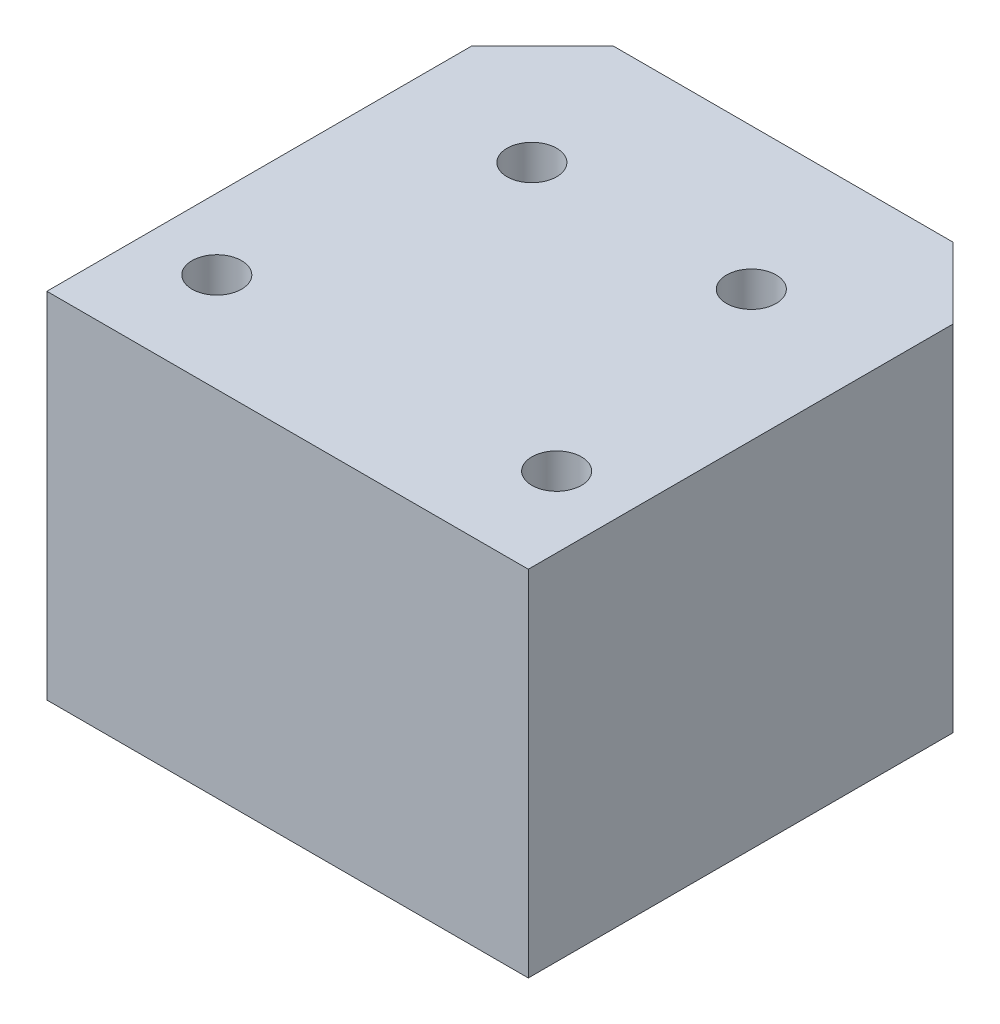
ISO-10303-21;
HEADER;
FILE_DESCRIPTION(('STEP AP214'),'2;1');
FILE_NAME('part.step','',(''),(''),'','','');
FILE_SCHEMA(('AUTOMOTIVE_DESIGN { 1 0 10303 214 1 1 1 1 }'));
ENDSEC;
DATA;
#1=APPLICATION_CONTEXT('core data for automotive mechanical design processes');
#2=APPLICATION_PROTOCOL_DEFINITION('international standard','automotive_design',2000,#1);
#3=PRODUCT_CONTEXT('',#1,'mechanical');
#4=PRODUCT('Part','Part','',(#3));
#5=PRODUCT_RELATED_PRODUCT_CATEGORY('part','',(#4));
#6=PRODUCT_DEFINITION_FORMATION('','',#4);
#7=PRODUCT_DEFINITION_CONTEXT('part definition',#1,'design');
#8=PRODUCT_DEFINITION('design','',#6,#7);
#9=PRODUCT_DEFINITION_SHAPE('','',#8);
#10=(LENGTH_UNIT() NAMED_UNIT(*) SI_UNIT(.MILLI.,.METRE.));
#11=(NAMED_UNIT(*) PLANE_ANGLE_UNIT() SI_UNIT($,.RADIAN.));
#12=(NAMED_UNIT(*) SI_UNIT($,.STERADIAN.) SOLID_ANGLE_UNIT());
#13=UNCERTAINTY_MEASURE_WITH_UNIT(LENGTH_MEASURE(1.E-05),#10,'distance_accuracy_value','');
#14=(GEOMETRIC_REPRESENTATION_CONTEXT(3) GLOBAL_UNCERTAINTY_ASSIGNED_CONTEXT((#13)) GLOBAL_UNIT_ASSIGNED_CONTEXT((#10,
#11,#12)) REPRESENTATION_CONTEXT('',''));
#15=CARTESIAN_POINT('',(0.,0.,0.));
#16=DIRECTION('',(0.,0.,1.));
#17=DIRECTION('',(1.,0.,0.));
#18=AXIS2_PLACEMENT_3D('',#15,#16,#17);
#19=CARTESIAN_POINT('',(-25.6426243932516,41.5511884848521,-30.));
#20=DIRECTION('',(-1.,0.,0.));
#21=DIRECTION('',(0.,-1.,0.));
#22=AXIS2_PLACEMENT_3D('',#19,#20,#21);
#23=PLANE('',#22);
#24=DIRECTION('',(0.,0.,1.));
#25=VECTOR('',#24,1.);
#26=CARTESIAN_POINT('',(-25.6426243932516,66.5511884848521,-30.));
#27=LINE('',#26,#25);
#28=CARTESIAN_POINT('',(-25.6426243932516,66.5511884848521,-25.));
#29=VERTEX_POINT('',#28);
#30=CARTESIAN_POINT('',(-25.6426243932516,66.5511884848521,5.));
#31=VERTEX_POINT('',#30);
#32=EDGE_CURVE('E90',#29,#31,#27,.T.);
#33=ORIENTED_EDGE('',*,*,#32,.F.);
#34=DIRECTION('',(0.,-1.,0.));
#35=VECTOR('',#34,1.);
#36=CARTESIAN_POINT('',(-25.6426243932516,41.5511884848521,-25.));
#37=LINE('',#36,#35);
#38=CARTESIAN_POINT('',(-25.6426243932516,41.5511884848521,-25.));
#39=VERTEX_POINT('',#38);
#40=EDGE_CURVE('E100',#29,#39,#37,.T.);
#41=ORIENTED_EDGE('',*,*,#40,.T.);
#42=DIRECTION('',(0.,0.,1.));
#43=VECTOR('',#42,1.);
#44=CARTESIAN_POINT('',(-25.6426243932516,41.5511884848521,-30.));
#45=LINE('',#44,#43);
#46=CARTESIAN_POINT('',(-25.6426243932516,41.5511884848521,5.));
#47=VERTEX_POINT('',#46);
#48=EDGE_CURVE('E106',#39,#47,#45,.T.);
#49=ORIENTED_EDGE('',*,*,#48,.T.);
#50=DIRECTION('',(0.,-1.,0.));
#51=VECTOR('',#50,1.);
#52=CARTESIAN_POINT('',(-25.6426243932516,66.5511884848521,5.));
#53=LINE('',#52,#51);
#54=EDGE_CURVE('E104',#31,#47,#53,.T.);
#55=ORIENTED_EDGE('',*,*,#54,.F.);
#56=EDGE_LOOP('',(#33,#41,#49,#55));
#57=FACE_BOUND('',#56,.T.);
#58=ADVANCED_FACE('F35',(#57),#23,.T.);
#59=CARTESIAN_POINT('',(8.35737560674839,66.5511884848521,-30.));
#60=DIRECTION('',(0.,1.,0.));
#61=DIRECTION('',(0.,0.,1.));
#62=AXIS2_PLACEMENT_3D('',#59,#60,#61);
#63=PLANE('',#62);
#64=CARTESIAN_POINT('',(-20.6426243932516,66.5511884848521,-2.));
#65=DIRECTION('',(0.,-1.,0.));
#66=DIRECTION('',(1.,0.,0.));
#67=AXIS2_PLACEMENT_3D('',#64,#65,#66);
#68=CIRCLE('',#67,1.75);
#69=CARTESIAN_POINT('',(-18.8926243932516,66.5511884848521,-2.));
#70=VERTEX_POINT('',#69);
#71=EDGE_CURVE('E210',#70,#70,#68,.T.);
#72=ORIENTED_EDGE('',*,*,#71,.T.);
#73=EDGE_LOOP('',(#72));
#74=FACE_BOUND('',#73,.T.);
#75=CARTESIAN_POINT('',(3.35737560674838,66.5511884848521,-2.));
#76=DIRECTION('',(0.,-1.,0.));
#77=DIRECTION('',(-1.,0.,0.));
#78=AXIS2_PLACEMENT_3D('',#75,#76,#77);
#79=CIRCLE('',#78,1.75);
#80=CARTESIAN_POINT('',(1.60737560674838,66.5511884848521,-2.));
#81=VERTEX_POINT('',#80);
#82=EDGE_CURVE('E201',#81,#81,#79,.T.);
#83=ORIENTED_EDGE('',*,*,#82,.T.);
#84=EDGE_LOOP('',(#83));
#85=FACE_BOUND('',#84,.T.);
#86=CARTESIAN_POINT('',(-0.892624393251621,66.5511884848521,-20.));
#87=DIRECTION('',(0.,-1.,0.));
#88=DIRECTION('',(1.,0.,0.));
#89=AXIS2_PLACEMENT_3D('',#86,#87,#88);
#90=CIRCLE('',#89,1.75);
#91=CARTESIAN_POINT('',(0.85737560674838,66.5511884848521,-20.));
#92=VERTEX_POINT('',#91);
#93=EDGE_CURVE('E196',#92,#92,#90,.T.);
#94=ORIENTED_EDGE('',*,*,#93,.T.);
#95=EDGE_LOOP('',(#94));
#96=FACE_BOUND('',#95,.T.);
#97=CARTESIAN_POINT('',(-16.3926243932516,66.5511884848521,-20.));
#98=DIRECTION('',(0.,-1.,0.));
#99=DIRECTION('',(1.,0.,0.));
#100=AXIS2_PLACEMENT_3D('',#97,#98,#99);
#101=CIRCLE('',#100,1.75);
#102=CARTESIAN_POINT('',(-14.6426243932516,66.5511884848521,-20.));
#103=VERTEX_POINT('',#102);
#104=EDGE_CURVE('E116',#103,#103,#101,.T.);
#105=ORIENTED_EDGE('',*,*,#104,.T.);
#106=EDGE_LOOP('',(#105));
#107=FACE_BOUND('',#106,.T.);
#108=DIRECTION('',(-1.,0.,0.));
#109=VECTOR('',#108,1.);
#110=CARTESIAN_POINT('',(8.35737560674839,66.5511884848521,-30.));
#111=LINE('',#110,#109);
#112=CARTESIAN_POINT('',(3.35737560674837,66.5511884848521,-30.));
#113=VERTEX_POINT('',#112);
#114=CARTESIAN_POINT('',(-20.6426243932516,66.5511884848521,-30.));
#115=VERTEX_POINT('',#114);
#116=EDGE_CURVE('E128',#113,#115,#111,.T.);
#117=ORIENTED_EDGE('',*,*,#116,.T.);
#118=DIRECTION('',(-0.707106781186549,0.,0.707106781186546));
#119=VECTOR('',#118,1.);
#120=CARTESIAN_POINT('',(-6.14262439325155,66.5511884848521,-44.5));
#121=LINE('',#120,#119);
#122=EDGE_CURVE('E43',#115,#29,#121,.T.);
#123=ORIENTED_EDGE('',*,*,#122,.T.);
#124=ORIENTED_EDGE('',*,*,#32,.T.);
#125=DIRECTION('',(-1.,0.,0.));
#126=VECTOR('',#125,1.);
#127=CARTESIAN_POINT('',(8.35737560674839,66.5511884848521,5.));
#128=LINE('',#127,#126);
#129=CARTESIAN_POINT('',(8.35737560674839,66.5511884848521,5.));
#130=VERTEX_POINT('',#129);
#131=EDGE_CURVE('E95',#130,#31,#128,.T.);
#132=ORIENTED_EDGE('',*,*,#131,.F.);
#133=DIRECTION('',(0.,0.,1.));
#134=VECTOR('',#133,1.);
#135=CARTESIAN_POINT('',(8.35737560674839,66.5511884848521,-30.));
#136=LINE('',#135,#134);
#137=CARTESIAN_POINT('',(8.35737560674839,66.5511884848521,-25.));
#138=VERTEX_POINT('',#137);
#139=EDGE_CURVE('E101',#138,#130,#136,.T.);
#140=ORIENTED_EDGE('',*,*,#139,.F.);
#141=DIRECTION('',(-0.707106781186549,0.,-0.707106781186546));
#142=VECTOR('',#141,1.);
#143=CARTESIAN_POINT('',(5.85737560674839,66.5511884848521,-27.5));
#144=LINE('',#143,#142);
#145=EDGE_CURVE('E50',#138,#113,#144,.T.);
#146=ORIENTED_EDGE('',*,*,#145,.T.);
#147=EDGE_LOOP('',(#117,#123,#124,#132,#140,#146));
#148=FACE_BOUND('',#147,.T.);
#149=ADVANCED_FACE('F92',(#74,#85,#96,#107,#148),#63,.T.);
#150=CARTESIAN_POINT('',(8.35737560674839,41.5511884848521,-30.));
#151=DIRECTION('',(1.,0.,0.));
#152=DIRECTION('',(0.,0.,-1.));
#153=AXIS2_PLACEMENT_3D('',#150,#151,#152);
#154=PLANE('',#153);
#155=DIRECTION('',(0.,0.,1.));
#156=VECTOR('',#155,1.);
#157=CARTESIAN_POINT('',(8.35737560674839,41.5511884848521,-30.));
#158=LINE('',#157,#156);
#159=CARTESIAN_POINT('',(8.35737560674839,41.5511884848521,-25.));
#160=VERTEX_POINT('',#159);
#161=CARTESIAN_POINT('',(8.35737560674839,41.5511884848521,5.));
#162=VERTEX_POINT('',#161);
#163=EDGE_CURVE('E131',#160,#162,#158,.T.);
#164=ORIENTED_EDGE('',*,*,#163,.F.);
#165=DIRECTION('',(0.,1.,0.));
#166=VECTOR('',#165,1.);
#167=CARTESIAN_POINT('',(8.35737560674839,66.5511884848521,-25.));
#168=LINE('',#167,#166);
#169=EDGE_CURVE('E11',#160,#138,#168,.T.);
#170=ORIENTED_EDGE('',*,*,#169,.T.);
#171=ORIENTED_EDGE('',*,*,#139,.T.);
#172=DIRECTION('',(0.,1.,0.));
#173=VECTOR('',#172,1.);
#174=CARTESIAN_POINT('',(8.35737560674839,41.5511884848521,5.));
#175=LINE('',#174,#173);
#176=EDGE_CURVE('E115',#162,#130,#175,.T.);
#177=ORIENTED_EDGE('',*,*,#176,.F.);
#178=EDGE_LOOP('',(#164,#170,#171,#177));
#179=FACE_BOUND('',#178,.T.);
#180=ADVANCED_FACE('F148',(#179),#154,.T.);
#181=CARTESIAN_POINT('',(8.35737560674839,41.5511884848521,-30.));
#182=DIRECTION('',(0.,-1.,0.));
#183=DIRECTION('',(1.,0.,0.));
#184=AXIS2_PLACEMENT_3D('',#181,#182,#183);
#185=PLANE('',#184);
#186=CARTESIAN_POINT('',(-20.6426243932516,41.5511884848521,-2.));
#187=DIRECTION('',(0.,-1.,0.));
#188=DIRECTION('',(1.,0.,0.));
#189=AXIS2_PLACEMENT_3D('',#186,#187,#188);
#190=CIRCLE('',#189,1.75);
#191=CARTESIAN_POINT('',(-18.8926243932516,41.5511884848521,-2.));
#192=VERTEX_POINT('',#191);
#193=EDGE_CURVE('E213',#192,#192,#190,.T.);
#194=ORIENTED_EDGE('',*,*,#193,.F.);
#195=EDGE_LOOP('',(#194));
#196=FACE_BOUND('',#195,.T.);
#197=CARTESIAN_POINT('',(3.35737560674839,41.5511884848521,-2.));
#198=DIRECTION('',(0.,-1.,0.));
#199=DIRECTION('',(-1.,0.,0.));
#200=AXIS2_PLACEMENT_3D('',#197,#198,#199);
#201=CIRCLE('',#200,1.75);
#202=CARTESIAN_POINT('',(1.60737560674839,41.5511884848521,-2.));
#203=VERTEX_POINT('',#202);
#204=EDGE_CURVE('E205',#203,#203,#201,.T.);
#205=ORIENTED_EDGE('',*,*,#204,.F.);
#206=EDGE_LOOP('',(#205));
#207=FACE_BOUND('',#206,.T.);
#208=CARTESIAN_POINT('',(-0.892624393251616,41.5511884848521,-20.));
#209=DIRECTION('',(0.,-1.,0.));
#210=DIRECTION('',(1.,0.,0.));
#211=AXIS2_PLACEMENT_3D('',#208,#209,#210);
#212=CIRCLE('',#211,1.75);
#213=CARTESIAN_POINT('',(0.857375606748385,41.5511884848521,-20.));
#214=VERTEX_POINT('',#213);
#215=EDGE_CURVE('E199',#214,#214,#212,.T.);
#216=ORIENTED_EDGE('',*,*,#215,.F.);
#217=EDGE_LOOP('',(#216));
#218=FACE_BOUND('',#217,.T.);
#219=CARTESIAN_POINT('',(-16.3926243932516,41.5511884848521,-20.));
#220=DIRECTION('',(0.,-1.,0.));
#221=DIRECTION('',(1.,0.,0.));
#222=AXIS2_PLACEMENT_3D('',#219,#220,#221);
#223=CIRCLE('',#222,1.75);
#224=CARTESIAN_POINT('',(-14.6426243932516,41.5511884848521,-20.));
#225=VERTEX_POINT('',#224);
#226=EDGE_CURVE('E119',#225,#225,#223,.T.);
#227=ORIENTED_EDGE('',*,*,#226,.F.);
#228=EDGE_LOOP('',(#227));
#229=FACE_BOUND('',#228,.T.);
#230=ORIENTED_EDGE('',*,*,#48,.F.);
#231=DIRECTION('',(0.707106781186549,0.,-0.707106781186546));
#232=VECTOR('',#231,1.);
#233=CARTESIAN_POINT('',(-6.14262439325155,41.5511884848521,-44.5));
#234=LINE('',#233,#232);
#235=CARTESIAN_POINT('',(-20.6426243932516,41.5511884848521,-30.));
#236=VERTEX_POINT('',#235);
#237=EDGE_CURVE('E137',#39,#236,#234,.T.);
#238=ORIENTED_EDGE('',*,*,#237,.T.);
#239=DIRECTION('',(1.,0.,0.));
#240=VECTOR('',#239,1.);
#241=CARTESIAN_POINT('',(8.35737560674839,41.5511884848521,-30.));
#242=LINE('',#241,#240);
#243=CARTESIAN_POINT('',(3.35737560674837,41.5511884848521,-30.));
#244=VERTEX_POINT('',#243);
#245=EDGE_CURVE('E125',#236,#244,#242,.T.);
#246=ORIENTED_EDGE('',*,*,#245,.T.);
#247=DIRECTION('',(0.707106781186549,0.,0.707106781186546));
#248=VECTOR('',#247,1.);
#249=CARTESIAN_POINT('',(5.85737560674839,41.5511884848521,-27.5));
#250=LINE('',#249,#248);
#251=EDGE_CURVE('E135',#244,#160,#250,.T.);
#252=ORIENTED_EDGE('',*,*,#251,.T.);
#253=ORIENTED_EDGE('',*,*,#163,.T.);
#254=DIRECTION('',(1.,0.,0.));
#255=VECTOR('',#254,1.);
#256=CARTESIAN_POINT('',(-25.6426243932516,41.5511884848521,5.));
#257=LINE('',#256,#255);
#258=EDGE_CURVE('E110',#47,#162,#257,.T.);
#259=ORIENTED_EDGE('',*,*,#258,.F.);
#260=EDGE_LOOP('',(#230,#238,#246,#252,#253,#259));
#261=FACE_BOUND('',#260,.T.);
#262=ADVANCED_FACE('F146',(#196,#207,#218,#229,#261),#185,.T.);
#263=CARTESIAN_POINT('',(0.,0.,-30.));
#264=DIRECTION('',(0.,0.,1.));
#265=DIRECTION('',(1.,0.,0.));
#266=AXIS2_PLACEMENT_3D('',#263,#264,#265);
#267=PLANE('',#266);
#268=ORIENTED_EDGE('',*,*,#245,.F.);
#269=DIRECTION('',(0.,1.,0.));
#270=VECTOR('',#269,1.);
#271=CARTESIAN_POINT('',(-20.6426243932516,66.5511884848521,-30.));
#272=LINE('',#271,#270);
#273=EDGE_CURVE('E57',#236,#115,#272,.T.);
#274=ORIENTED_EDGE('',*,*,#273,.T.);
#275=ORIENTED_EDGE('',*,*,#116,.F.);
#276=DIRECTION('',(0.,-1.,0.));
#277=VECTOR('',#276,1.);
#278=CARTESIAN_POINT('',(3.35737560674837,41.5511884848521,-30.));
#279=LINE('',#278,#277);
#280=EDGE_CURVE('E139',#113,#244,#279,.T.);
#281=ORIENTED_EDGE('',*,*,#280,.T.);
#282=EDGE_LOOP('',(#268,#274,#275,#281));
#283=FACE_BOUND('',#282,.T.);
#284=ADVANCED_FACE('F142',(#283),#267,.F.);
#285=CARTESIAN_POINT('',(0.,0.,5.));
#286=DIRECTION('',(0.,0.,1.));
#287=DIRECTION('',(1.,0.,0.));
#288=AXIS2_PLACEMENT_3D('',#285,#286,#287);
#289=PLANE('',#288);
#290=ORIENTED_EDGE('',*,*,#131,.T.);
#291=ORIENTED_EDGE('',*,*,#54,.T.);
#292=ORIENTED_EDGE('',*,*,#258,.T.);
#293=ORIENTED_EDGE('',*,*,#176,.T.);
#294=EDGE_LOOP('',(#290,#291,#292,#293));
#295=FACE_BOUND('',#294,.T.);
#296=ADVANCED_FACE('F113',(#295),#289,.T.);
#297=CARTESIAN_POINT('',(-25.6426243932516,41.5511884848521,-25.));
#298=DIRECTION('',(-0.707106781186546,0.,-0.707106781186549));
#299=DIRECTION('',(0.,1.,0.));
#300=AXIS2_PLACEMENT_3D('',#297,#298,#299);
#301=PLANE('',#300);
#302=ORIENTED_EDGE('',*,*,#122,.F.);
#303=ORIENTED_EDGE('',*,*,#273,.F.);
#304=ORIENTED_EDGE('',*,*,#237,.F.);
#305=ORIENTED_EDGE('',*,*,#40,.F.);
#306=EDGE_LOOP('',(#302,#303,#304,#305));
#307=FACE_BOUND('',#306,.T.);
#308=ADVANCED_FACE('F163',(#307),#301,.T.);
#309=CARTESIAN_POINT('',(8.35737560674839,41.5511884848521,-25.));
#310=DIRECTION('',(0.707106781186546,0.,-0.707106781186549));
#311=DIRECTION('',(0.,-1.,0.));
#312=AXIS2_PLACEMENT_3D('',#309,#310,#311);
#313=PLANE('',#312);
#314=ORIENTED_EDGE('',*,*,#251,.F.);
#315=ORIENTED_EDGE('',*,*,#280,.F.);
#316=ORIENTED_EDGE('',*,*,#145,.F.);
#317=ORIENTED_EDGE('',*,*,#169,.F.);
#318=EDGE_LOOP('',(#314,#315,#316,#317));
#319=FACE_BOUND('',#318,.T.);
#320=ADVANCED_FACE('F37',(#319),#313,.T.);
#321=CARTESIAN_POINT('',(-16.3926243932516,66.5511884848521,-20.));
#322=DIRECTION('',(0.,-1.,0.));
#323=DIRECTION('',(1.,0.,0.));
#324=AXIS2_PLACEMENT_3D('',#321,#322,#323);
#325=CYLINDRICAL_SURFACE('',#324,1.75);
#326=ORIENTED_EDGE('',*,*,#104,.F.);
#327=EDGE_LOOP('',(#326));
#328=FACE_BOUND('',#327,.T.);
#329=ORIENTED_EDGE('',*,*,#226,.T.);
#330=EDGE_LOOP('',(#329));
#331=FACE_BOUND('',#330,.T.);
#332=ADVANCED_FACE('F170',(#328,#331),#325,.F.);
#333=CARTESIAN_POINT('',(-0.892624393251621,66.5511884848521,-20.));
#334=DIRECTION('',(0.,-1.,0.));
#335=DIRECTION('',(1.,0.,0.));
#336=AXIS2_PLACEMENT_3D('',#333,#334,#335);
#337=CYLINDRICAL_SURFACE('',#336,1.75);
#338=ORIENTED_EDGE('',*,*,#93,.F.);
#339=EDGE_LOOP('',(#338));
#340=FACE_BOUND('',#339,.T.);
#341=ORIENTED_EDGE('',*,*,#215,.T.);
#342=EDGE_LOOP('',(#341));
#343=FACE_BOUND('',#342,.T.);
#344=ADVANCED_FACE('F179',(#340,#343),#337,.F.);
#345=CARTESIAN_POINT('',(3.35737560674838,66.5511884848521,-2.));
#346=DIRECTION('',(0.,-1.,0.));
#347=DIRECTION('',(1.,0.,0.));
#348=AXIS2_PLACEMENT_3D('',#345,#346,#347);
#349=CYLINDRICAL_SURFACE('',#348,1.75);
#350=ORIENTED_EDGE('',*,*,#82,.F.);
#351=EDGE_LOOP('',(#350));
#352=FACE_BOUND('',#351,.T.);
#353=ORIENTED_EDGE('',*,*,#204,.T.);
#354=EDGE_LOOP('',(#353));
#355=FACE_BOUND('',#354,.T.);
#356=ADVANCED_FACE('F184',(#352,#355),#349,.F.);
#357=CARTESIAN_POINT('',(-20.6426243932516,66.5511884848521,-2.));
#358=DIRECTION('',(0.,-1.,0.));
#359=DIRECTION('',(1.,0.,0.));
#360=AXIS2_PLACEMENT_3D('',#357,#358,#359);
#361=CYLINDRICAL_SURFACE('',#360,1.75);
#362=ORIENTED_EDGE('',*,*,#71,.F.);
#363=EDGE_LOOP('',(#362));
#364=FACE_BOUND('',#363,.T.);
#365=ORIENTED_EDGE('',*,*,#193,.T.);
#366=EDGE_LOOP('',(#365));
#367=FACE_BOUND('',#366,.T.);
#368=ADVANCED_FACE('F181',(#364,#367),#361,.F.);
#369=CLOSED_SHELL('',(#58,#149,#180,#262,#284,#296,#308,#320,#332,#344,#356,#368));
#370=MANIFOLD_SOLID_BREP('B2',#369);
#371=ADVANCED_BREP_SHAPE_REPRESENTATION('',(#18,#370),#14);
#372=SHAPE_DEFINITION_REPRESENTATION(#9,#371);
ENDSEC;
END-ISO-10303-21;
